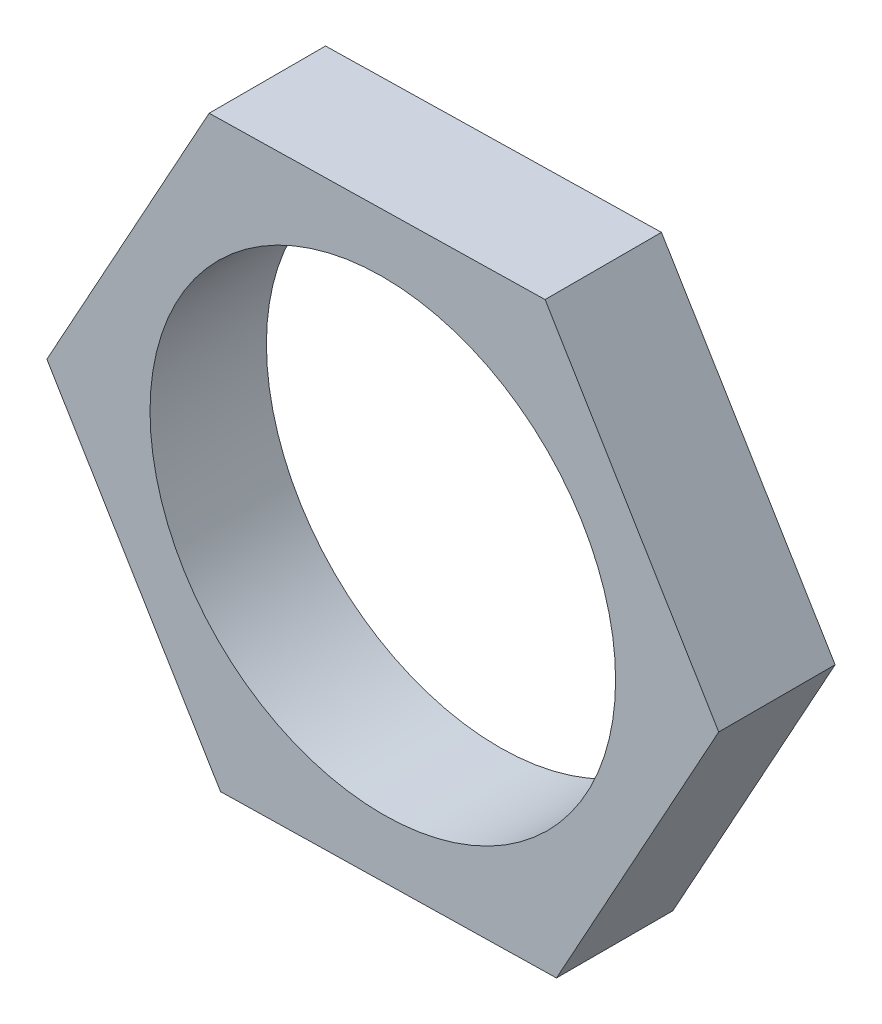
ISO-10303-21;
HEADER;
FILE_DESCRIPTION(('STEP AP214'),'2;1');
FILE_NAME('part.step','',(''),(''),'','','');
FILE_SCHEMA(('AUTOMOTIVE_DESIGN { 1 0 10303 214 1 1 1 1 }'));
ENDSEC;
DATA;
#1=APPLICATION_CONTEXT('core data for automotive mechanical design processes');
#2=APPLICATION_PROTOCOL_DEFINITION('international standard','automotive_design',2000,#1);
#3=PRODUCT_CONTEXT('',#1,'mechanical');
#4=PRODUCT('Part','Part','',(#3));
#5=PRODUCT_RELATED_PRODUCT_CATEGORY('part','',(#4));
#6=PRODUCT_DEFINITION_FORMATION('','',#4);
#7=PRODUCT_DEFINITION_CONTEXT('part definition',#1,'design');
#8=PRODUCT_DEFINITION('design','',#6,#7);
#9=PRODUCT_DEFINITION_SHAPE('','',#8);
#10=(LENGTH_UNIT() NAMED_UNIT(*) SI_UNIT(.MILLI.,.METRE.));
#11=(NAMED_UNIT(*) PLANE_ANGLE_UNIT() SI_UNIT($,.RADIAN.));
#12=(NAMED_UNIT(*) SI_UNIT($,.STERADIAN.) SOLID_ANGLE_UNIT());
#13=UNCERTAINTY_MEASURE_WITH_UNIT(LENGTH_MEASURE(1.E-05),#10,'distance_accuracy_value','');
#14=(GEOMETRIC_REPRESENTATION_CONTEXT(3) GLOBAL_UNCERTAINTY_ASSIGNED_CONTEXT((#13)) GLOBAL_UNIT_ASSIGNED_CONTEXT((#10,
#11,#12)) REPRESENTATION_CONTEXT('',''));
#15=CARTESIAN_POINT('',(0.,0.,0.));
#16=DIRECTION('',(0.,0.,1.));
#17=DIRECTION('',(1.,0.,0.));
#18=AXIS2_PLACEMENT_3D('',#15,#16,#17);
#19=CARTESIAN_POINT('',(0.,0.,12.7));
#20=DIRECTION('',(0.,0.,1.));
#21=DIRECTION('',(1.,0.,0.));
#22=AXIS2_PLACEMENT_3D('',#19,#20,#21);
#23=PLANE('',#22);
#24=DIRECTION('',(-0.516842400177809,0.856080564770888,0.));
#25=VECTOR('',#24,1.);
#26=CARTESIAN_POINT('',(36.6547293206385,0.717043767183733,12.7));
#27=LINE('',#26,#25);
#28=CARTESIAN_POINT('',(36.6547293206385,0.717043767183733,12.7));
#29=VERTEX_POINT('',#28);
#30=CARTESIAN_POINT('',(17.7063865423129,32.1024486441071,12.7));
#31=VERTEX_POINT('',#30);
#32=EDGE_CURVE('E139',#29,#31,#27,.T.);
#33=ORIENTED_EDGE('',*,*,#32,.T.);
#34=DIRECTION('',(-0.999808716866623,-0.0195583659214615,0.));
#35=VECTOR('',#34,1.);
#36=CARTESIAN_POINT('',(17.7063865423129,32.1024486441071,12.7));
#37=LINE('',#36,#35);
#38=CARTESIAN_POINT('',(-18.9483427783257,31.3854048769234,12.7));
#39=VERTEX_POINT('',#38);
#40=EDGE_CURVE('E97',#31,#39,#37,.T.);
#41=ORIENTED_EDGE('',*,*,#40,.T.);
#42=DIRECTION('',(-0.482966316688814,-0.875638930692349,0.));
#43=VECTOR('',#42,1.);
#44=CARTESIAN_POINT('',(-18.9483427783257,31.3854048769234,12.7));
#45=LINE('',#44,#43);
#46=CARTESIAN_POINT('',(-36.6547293206385,-0.717043767183726,12.7));
#47=VERTEX_POINT('',#46);
#48=EDGE_CURVE('E110',#39,#47,#45,.T.);
#49=ORIENTED_EDGE('',*,*,#48,.T.);
#50=DIRECTION('',(0.516842400177809,-0.856080564770888,0.));
#51=VECTOR('',#50,1.);
#52=CARTESIAN_POINT('',(-36.6547293206385,-0.717043767183726,12.7));
#53=LINE('',#52,#51);
#54=CARTESIAN_POINT('',(-17.7063865423128,-32.1024486441071,12.7));
#55=VERTEX_POINT('',#54);
#56=EDGE_CURVE('E104',#47,#55,#53,.T.);
#57=ORIENTED_EDGE('',*,*,#56,.T.);
#58=DIRECTION('',(0.999808716866623,0.0195583659214617,0.));
#59=VECTOR('',#58,1.);
#60=CARTESIAN_POINT('',(-17.7063865423128,-32.1024486441071,12.7));
#61=LINE('',#60,#59);
#62=CARTESIAN_POINT('',(18.9483427783257,-31.3854048769234,12.7));
#63=VERTEX_POINT('',#62);
#64=EDGE_CURVE('E108',#55,#63,#61,.T.);
#65=ORIENTED_EDGE('',*,*,#64,.T.);
#66=DIRECTION('',(0.482966316688814,0.875638930692349,0.));
#67=VECTOR('',#66,1.);
#68=CARTESIAN_POINT('',(18.9483427783257,-31.3854048769234,12.7));
#69=LINE('',#68,#67);
#70=EDGE_CURVE('E60',#63,#29,#69,.T.);
#71=ORIENTED_EDGE('',*,*,#70,.T.);
#72=EDGE_LOOP('',(#33,#41,#49,#57,#65,#71));
#73=FACE_BOUND('',#72,.T.);
#74=CARTESIAN_POINT('',(0.,0.,12.7));
#75=DIRECTION('',(0.,0.,1.));
#76=DIRECTION('',(1.,0.,0.));
#77=AXIS2_PLACEMENT_3D('',#74,#75,#76);
#78=CIRCLE('',#77,25.4);
#79=CARTESIAN_POINT('',(25.4,0.,12.7));
#80=VERTEX_POINT('',#79);
#81=EDGE_CURVE('E132',#80,#80,#78,.T.);
#82=ORIENTED_EDGE('',*,*,#81,.F.);
#83=EDGE_LOOP('',(#82));
#84=FACE_BOUND('',#83,.T.);
#85=ADVANCED_FACE('F43',(#73,#84),#23,.T.);
#86=CARTESIAN_POINT('',(0.,0.,0.));
#87=DIRECTION('',(0.,0.,1.));
#88=DIRECTION('',(1.,0.,0.));
#89=AXIS2_PLACEMENT_3D('',#86,#87,#88);
#90=PLANE('',#89);
#91=DIRECTION('',(-0.516842400177809,0.856080564770888,0.));
#92=VECTOR('',#91,1.);
#93=CARTESIAN_POINT('',(36.6547293206385,0.717043767183733,0.));
#94=LINE('',#93,#92);
#95=CARTESIAN_POINT('',(36.6547293206385,0.717043767183733,0.));
#96=VERTEX_POINT('',#95);
#97=CARTESIAN_POINT('',(17.7063865423129,32.1024486441071,0.));
#98=VERTEX_POINT('',#97);
#99=EDGE_CURVE('E128',#96,#98,#94,.T.);
#100=ORIENTED_EDGE('',*,*,#99,.F.);
#101=DIRECTION('',(0.482966316688814,0.875638930692349,0.));
#102=VECTOR('',#101,1.);
#103=CARTESIAN_POINT('',(18.9483427783257,-31.3854048769234,0.));
#104=LINE('',#103,#102);
#105=CARTESIAN_POINT('',(18.9483427783257,-31.3854048769234,0.));
#106=VERTEX_POINT('',#105);
#107=EDGE_CURVE('E89',#106,#96,#104,.T.);
#108=ORIENTED_EDGE('',*,*,#107,.F.);
#109=DIRECTION('',(0.999808716866623,0.0195583659214617,0.));
#110=VECTOR('',#109,1.);
#111=CARTESIAN_POINT('',(-17.7063865423128,-32.1024486441071,0.));
#112=LINE('',#111,#110);
#113=CARTESIAN_POINT('',(-17.7063865423128,-32.1024486441071,0.));
#114=VERTEX_POINT('',#113);
#115=EDGE_CURVE('E83',#114,#106,#112,.T.);
#116=ORIENTED_EDGE('',*,*,#115,.F.);
#117=DIRECTION('',(0.516842400177809,-0.856080564770888,0.));
#118=VECTOR('',#117,1.);
#119=CARTESIAN_POINT('',(-36.6547293206385,-0.717043767183726,0.));
#120=LINE('',#119,#118);
#121=CARTESIAN_POINT('',(-36.6547293206385,-0.717043767183726,0.));
#122=VERTEX_POINT('',#121);
#123=EDGE_CURVE('E118',#122,#114,#120,.T.);
#124=ORIENTED_EDGE('',*,*,#123,.F.);
#125=DIRECTION('',(-0.482966316688814,-0.875638930692349,0.));
#126=VECTOR('',#125,1.);
#127=CARTESIAN_POINT('',(-18.9483427783257,31.3854048769234,0.));
#128=LINE('',#127,#126);
#129=CARTESIAN_POINT('',(-18.9483427783257,31.3854048769234,0.));
#130=VERTEX_POINT('',#129);
#131=EDGE_CURVE('E134',#130,#122,#128,.T.);
#132=ORIENTED_EDGE('',*,*,#131,.F.);
#133=DIRECTION('',(-0.999808716866623,-0.0195583659214615,0.));
#134=VECTOR('',#133,1.);
#135=CARTESIAN_POINT('',(17.7063865423129,32.1024486441071,0.));
#136=LINE('',#135,#134);
#137=EDGE_CURVE('E131',#98,#130,#136,.T.);
#138=ORIENTED_EDGE('',*,*,#137,.F.);
#139=EDGE_LOOP('',(#100,#108,#116,#124,#132,#138));
#140=FACE_BOUND('',#139,.T.);
#141=CARTESIAN_POINT('',(0.,0.,0.));
#142=DIRECTION('',(0.,0.,1.));
#143=DIRECTION('',(1.,0.,0.));
#144=AXIS2_PLACEMENT_3D('',#141,#142,#143);
#145=CIRCLE('',#144,25.4);
#146=CARTESIAN_POINT('',(25.4,0.,0.));
#147=VERTEX_POINT('',#146);
#148=EDGE_CURVE('E234',#147,#147,#145,.T.);
#149=ORIENTED_EDGE('',*,*,#148,.T.);
#150=EDGE_LOOP('',(#149));
#151=FACE_BOUND('',#150,.T.);
#152=ADVANCED_FACE('F148',(#140,#151),#90,.F.);
#153=CARTESIAN_POINT('',(36.6547293206385,0.717043767183733,12.7));
#154=DIRECTION('',(-0.856080564770887,-0.516842400177809,0.));
#155=DIRECTION('',(0.516842400177809,-0.856080564770888,0.));
#156=AXIS2_PLACEMENT_3D('',#153,#154,#155);
#157=PLANE('',#156);
#158=ORIENTED_EDGE('',*,*,#99,.T.);
#159=DIRECTION('',(0.,0.,-1.));
#160=VECTOR('',#159,1.);
#161=CARTESIAN_POINT('',(17.7063865423129,32.1024486441071,12.7));
#162=LINE('',#161,#160);
#163=EDGE_CURVE('E12',#31,#98,#162,.T.);
#164=ORIENTED_EDGE('',*,*,#163,.F.);
#165=ORIENTED_EDGE('',*,*,#32,.F.);
#166=DIRECTION('',(0.,0.,-1.));
#167=VECTOR('',#166,1.);
#168=CARTESIAN_POINT('',(36.6547293206385,0.717043767183733,12.7));
#169=LINE('',#168,#167);
#170=EDGE_CURVE('E124',#29,#96,#169,.T.);
#171=ORIENTED_EDGE('',*,*,#170,.T.);
#172=EDGE_LOOP('',(#158,#164,#165,#171));
#173=FACE_BOUND('',#172,.T.);
#174=ADVANCED_FACE('F45',(#173),#157,.F.);
#175=CARTESIAN_POINT('',(17.7063865423129,32.1024486441071,12.7));
#176=DIRECTION('',(0.0195583659214615,-0.999808716866622,0.));
#177=DIRECTION('',(0.999808716866623,0.0195583659214615,0.));
#178=AXIS2_PLACEMENT_3D('',#175,#176,#177);
#179=PLANE('',#178);
#180=ORIENTED_EDGE('',*,*,#137,.T.);
#181=DIRECTION('',(0.,0.,-1.));
#182=VECTOR('',#181,1.);
#183=CARTESIAN_POINT('',(-18.9483427783257,31.3854048769234,12.7));
#184=LINE('',#183,#182);
#185=EDGE_CURVE('E52',#39,#130,#184,.T.);
#186=ORIENTED_EDGE('',*,*,#185,.F.);
#187=ORIENTED_EDGE('',*,*,#40,.F.);
#188=ORIENTED_EDGE('',*,*,#163,.T.);
#189=EDGE_LOOP('',(#180,#186,#187,#188));
#190=FACE_BOUND('',#189,.T.);
#191=ADVANCED_FACE('F173',(#190),#179,.F.);
#192=CARTESIAN_POINT('',(-18.9483427783257,31.3854048769234,12.7));
#193=DIRECTION('',(0.875638930692349,-0.482966316688814,0.));
#194=DIRECTION('',(0.482966316688814,0.875638930692349,0.));
#195=AXIS2_PLACEMENT_3D('',#192,#193,#194);
#196=PLANE('',#195);
#197=ORIENTED_EDGE('',*,*,#131,.T.);
#198=DIRECTION('',(0.,0.,-1.));
#199=VECTOR('',#198,1.);
#200=CARTESIAN_POINT('',(-36.6547293206385,-0.717043767183726,12.7));
#201=LINE('',#200,#199);
#202=EDGE_CURVE('E119',#47,#122,#201,.T.);
#203=ORIENTED_EDGE('',*,*,#202,.F.);
#204=ORIENTED_EDGE('',*,*,#48,.F.);
#205=ORIENTED_EDGE('',*,*,#185,.T.);
#206=EDGE_LOOP('',(#197,#203,#204,#205));
#207=FACE_BOUND('',#206,.T.);
#208=ADVANCED_FACE('F145',(#207),#196,.F.);
#209=CARTESIAN_POINT('',(-36.6547293206385,-0.717043767183726,12.7));
#210=DIRECTION('',(0.856080564770887,0.516842400177809,0.));
#211=DIRECTION('',(-0.516842400177809,0.856080564770888,0.));
#212=AXIS2_PLACEMENT_3D('',#209,#210,#211);
#213=PLANE('',#212);
#214=ORIENTED_EDGE('',*,*,#123,.T.);
#215=DIRECTION('',(0.,0.,-1.));
#216=VECTOR('',#215,1.);
#217=CARTESIAN_POINT('',(-17.7063865423128,-32.1024486441071,12.7));
#218=LINE('',#217,#216);
#219=EDGE_CURVE('E115',#55,#114,#218,.T.);
#220=ORIENTED_EDGE('',*,*,#219,.F.);
#221=ORIENTED_EDGE('',*,*,#56,.F.);
#222=ORIENTED_EDGE('',*,*,#202,.T.);
#223=EDGE_LOOP('',(#214,#220,#221,#222));
#224=FACE_BOUND('',#223,.T.);
#225=ADVANCED_FACE('F116',(#224),#213,.F.);
#226=CARTESIAN_POINT('',(-17.7063865423128,-32.1024486441071,12.7));
#227=DIRECTION('',(-0.0195583659214617,0.999808716866622,0.));
#228=DIRECTION('',(-0.999808716866623,-0.0195583659214617,0.));
#229=AXIS2_PLACEMENT_3D('',#226,#227,#228);
#230=PLANE('',#229);
#231=ORIENTED_EDGE('',*,*,#115,.T.);
#232=DIRECTION('',(0.,0.,-1.));
#233=VECTOR('',#232,1.);
#234=CARTESIAN_POINT('',(18.9483427783257,-31.3854048769234,12.7));
#235=LINE('',#234,#233);
#236=EDGE_CURVE('E120',#63,#106,#235,.T.);
#237=ORIENTED_EDGE('',*,*,#236,.F.);
#238=ORIENTED_EDGE('',*,*,#64,.F.);
#239=ORIENTED_EDGE('',*,*,#219,.T.);
#240=EDGE_LOOP('',(#231,#237,#238,#239));
#241=FACE_BOUND('',#240,.T.);
#242=ADVANCED_FACE('F122',(#241),#230,.F.);
#243=CARTESIAN_POINT('',(18.9483427783257,-31.3854048769234,12.7));
#244=DIRECTION('',(-0.875638930692349,0.482966316688814,0.));
#245=DIRECTION('',(-0.482966316688814,-0.875638930692349,0.));
#246=AXIS2_PLACEMENT_3D('',#243,#244,#245);
#247=PLANE('',#246);
#248=ORIENTED_EDGE('',*,*,#107,.T.);
#249=ORIENTED_EDGE('',*,*,#170,.F.);
#250=ORIENTED_EDGE('',*,*,#70,.F.);
#251=ORIENTED_EDGE('',*,*,#236,.T.);
#252=EDGE_LOOP('',(#248,#249,#250,#251));
#253=FACE_BOUND('',#252,.T.);
#254=ADVANCED_FACE('F153',(#253),#247,.F.);
#255=CARTESIAN_POINT('',(0.,0.,12.7));
#256=DIRECTION('',(0.,0.,-1.));
#257=DIRECTION('',(-1.,0.,0.));
#258=AXIS2_PLACEMENT_3D('',#255,#256,#257);
#259=CYLINDRICAL_SURFACE('',#258,25.4);
#260=ORIENTED_EDGE('',*,*,#81,.T.);
#261=EDGE_LOOP('',(#260));
#262=FACE_BOUND('',#261,.T.);
#263=ORIENTED_EDGE('',*,*,#148,.F.);
#264=EDGE_LOOP('',(#263));
#265=FACE_BOUND('',#264,.T.);
#266=ADVANCED_FACE('F155',(#262,#265),#259,.F.);
#267=CLOSED_SHELL('',(#85,#152,#174,#191,#208,#225,#242,#254,#266));
#268=MANIFOLD_SOLID_BREP('B2',#267);
#269=ADVANCED_BREP_SHAPE_REPRESENTATION('',(#18,#268),#14);
#270=SHAPE_DEFINITION_REPRESENTATION(#9,#269);
ENDSEC;
END-ISO-10303-21;
